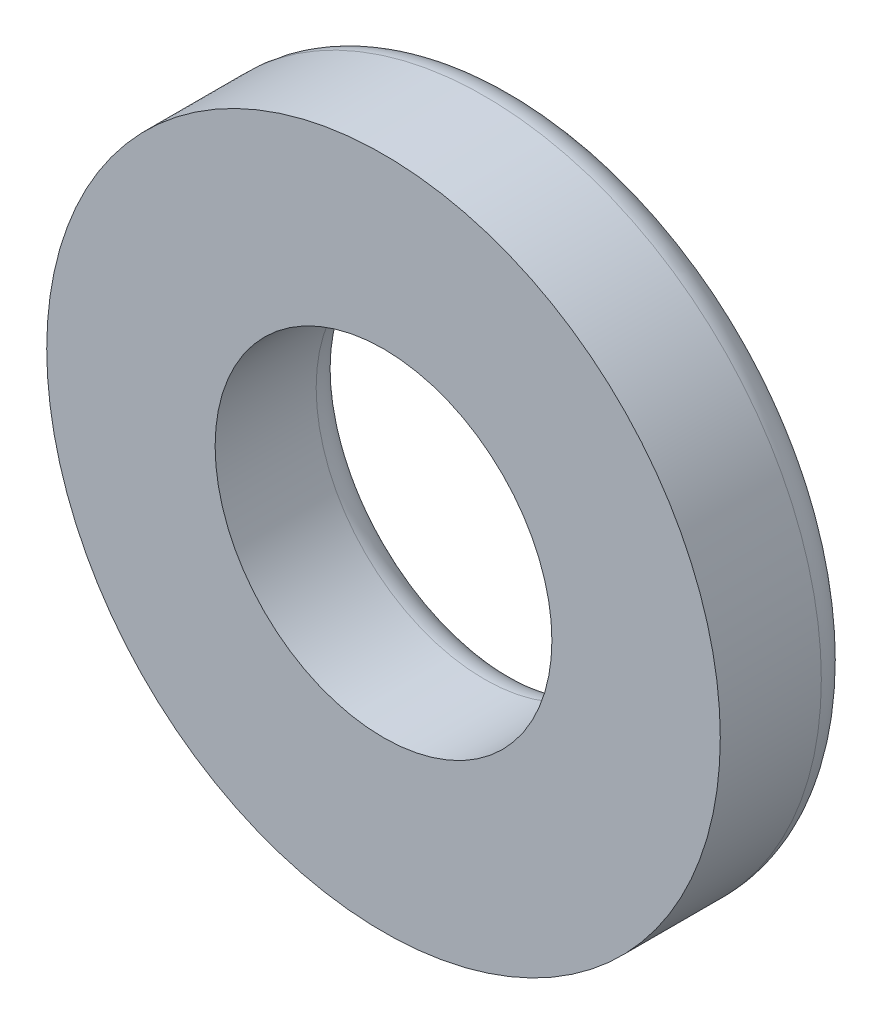
ISO-10303-21;
HEADER;
FILE_DESCRIPTION(('STEP AP214'),'2;1');
FILE_NAME('part.step','',(''),(''),'','','');
FILE_SCHEMA(('AUTOMOTIVE_DESIGN { 1 0 10303 214 1 1 1 1 }'));
ENDSEC;
DATA;
#1=APPLICATION_CONTEXT('core data for automotive mechanical design processes');
#2=APPLICATION_PROTOCOL_DEFINITION('international standard','automotive_design',2000,#1);
#3=PRODUCT_CONTEXT('',#1,'mechanical');
#4=PRODUCT('Part','Part','',(#3));
#5=PRODUCT_RELATED_PRODUCT_CATEGORY('part','',(#4));
#6=PRODUCT_DEFINITION_FORMATION('','',#4);
#7=PRODUCT_DEFINITION_CONTEXT('part definition',#1,'design');
#8=PRODUCT_DEFINITION('design','',#6,#7);
#9=PRODUCT_DEFINITION_SHAPE('','',#8);
#10=(LENGTH_UNIT() NAMED_UNIT(*) SI_UNIT(.MILLI.,.METRE.));
#11=(NAMED_UNIT(*) PLANE_ANGLE_UNIT() SI_UNIT($,.RADIAN.));
#12=(NAMED_UNIT(*) SI_UNIT($,.STERADIAN.) SOLID_ANGLE_UNIT());
#13=UNCERTAINTY_MEASURE_WITH_UNIT(LENGTH_MEASURE(1.E-05),#10,'distance_accuracy_value','');
#14=(GEOMETRIC_REPRESENTATION_CONTEXT(3) GLOBAL_UNCERTAINTY_ASSIGNED_CONTEXT((#13)) GLOBAL_UNIT_ASSIGNED_CONTEXT((#10,
#11,#12)) REPRESENTATION_CONTEXT('',''));
#15=CARTESIAN_POINT('',(0.,0.,0.));
#16=DIRECTION('',(0.,0.,1.));
#17=DIRECTION('',(1.,0.,0.));
#18=AXIS2_PLACEMENT_3D('',#15,#16,#17);
#19=CARTESIAN_POINT('',(0.,0.,12.));
#20=DIRECTION('',(0.,0.,1.));
#21=DIRECTION('',(1.,0.,0.));
#22=AXIS2_PLACEMENT_3D('',#19,#20,#21);
#23=PLANE('',#22);
#24=CARTESIAN_POINT('',(0.,0.,12.));
#25=DIRECTION('',(0.,0.,1.));
#26=DIRECTION('',(1.,0.,0.));
#27=AXIS2_PLACEMENT_3D('',#24,#25,#26);
#28=CIRCLE('',#27,30.);
#29=CARTESIAN_POINT('',(30.,0.,12.));
#30=VERTEX_POINT('',#29);
#31=EDGE_CURVE('E58',#30,#30,#28,.T.);
#32=ORIENTED_EDGE('',*,*,#31,.T.);
#33=EDGE_LOOP('',(#32));
#34=FACE_BOUND('',#33,.T.);
#35=CARTESIAN_POINT('',(0.,0.,12.));
#36=DIRECTION('',(0.,0.,1.));
#37=DIRECTION('',(1.,0.,0.));
#38=AXIS2_PLACEMENT_3D('',#35,#36,#37);
#39=CIRCLE('',#38,15.);
#40=CARTESIAN_POINT('',(15.,0.,12.));
#41=VERTEX_POINT('',#40);
#42=EDGE_CURVE('E61',#41,#41,#39,.T.);
#43=ORIENTED_EDGE('',*,*,#42,.F.);
#44=EDGE_LOOP('',(#43));
#45=FACE_BOUND('',#44,.T.);
#46=ADVANCED_FACE('F38',(#34,#45),#23,.T.);
#47=CARTESIAN_POINT('',(0.,0.,0.));
#48=DIRECTION('',(0.,0.,1.));
#49=DIRECTION('',(1.,0.,0.));
#50=AXIS2_PLACEMENT_3D('',#47,#48,#49);
#51=PLANE('',#50);
#52=CARTESIAN_POINT('',(0.,0.,0.));
#53=DIRECTION('',(0.,0.,1.));
#54=DIRECTION('',(1.,0.,0.));
#55=AXIS2_PLACEMENT_3D('',#52,#53,#54);
#56=CIRCLE('',#55,18.);
#57=CARTESIAN_POINT('',(18.,0.,0.));
#58=VERTEX_POINT('',#57);
#59=EDGE_CURVE('E49',#58,#58,#56,.T.);
#60=ORIENTED_EDGE('',*,*,#59,.T.);
#61=EDGE_LOOP('',(#60));
#62=FACE_BOUND('',#61,.T.);
#63=CARTESIAN_POINT('',(0.,0.,0.));
#64=DIRECTION('',(0.,0.,1.));
#65=DIRECTION('',(1.,0.,0.));
#66=AXIS2_PLACEMENT_3D('',#63,#64,#65);
#67=CIRCLE('',#66,27.);
#68=CARTESIAN_POINT('',(27.,0.,0.));
#69=VERTEX_POINT('',#68);
#70=EDGE_CURVE('E53',#69,#69,#67,.F.);
#71=ORIENTED_EDGE('',*,*,#70,.T.);
#72=EDGE_LOOP('',(#71));
#73=FACE_BOUND('',#72,.T.);
#74=ADVANCED_FACE('F68',(#62,#73),#51,.F.);
#75=CARTESIAN_POINT('',(0.,0.,12.));
#76=DIRECTION('',(0.,0.,-1.));
#77=DIRECTION('',(-1.,0.,0.));
#78=AXIS2_PLACEMENT_3D('',#75,#76,#77);
#79=CYLINDRICAL_SURFACE('',#78,30.);
#80=CARTESIAN_POINT('',(0.,0.,3.));
#81=DIRECTION('',(0.,0.,1.));
#82=DIRECTION('',(1.,0.,0.));
#83=AXIS2_PLACEMENT_3D('',#80,#81,#82);
#84=CIRCLE('',#83,30.);
#85=CARTESIAN_POINT('',(30.,0.,3.));
#86=VERTEX_POINT('',#85);
#87=EDGE_CURVE('E10',#86,#86,#84,.T.);
#88=ORIENTED_EDGE('',*,*,#87,.T.);
#89=EDGE_LOOP('',(#88));
#90=FACE_BOUND('',#89,.T.);
#91=ORIENTED_EDGE('',*,*,#31,.F.);
#92=EDGE_LOOP('',(#91));
#93=FACE_BOUND('',#92,.T.);
#94=ADVANCED_FACE('F75',(#90,#93),#79,.T.);
#95=CARTESIAN_POINT('',(0.,0.,12.));
#96=DIRECTION('',(0.,0.,-1.));
#97=DIRECTION('',(-1.,0.,0.));
#98=AXIS2_PLACEMENT_3D('',#95,#96,#97);
#99=CYLINDRICAL_SURFACE('',#98,15.);
#100=CARTESIAN_POINT('',(0.,0.,3.));
#101=DIRECTION('',(0.,0.,1.));
#102=DIRECTION('',(1.,0.,0.));
#103=AXIS2_PLACEMENT_3D('',#100,#101,#102);
#104=CIRCLE('',#103,15.);
#105=CARTESIAN_POINT('',(15.,0.,3.));
#106=VERTEX_POINT('',#105);
#107=EDGE_CURVE('E45',#106,#106,#104,.F.);
#108=ORIENTED_EDGE('',*,*,#107,.T.);
#109=EDGE_LOOP('',(#108));
#110=FACE_BOUND('',#109,.T.);
#111=ORIENTED_EDGE('',*,*,#42,.T.);
#112=EDGE_LOOP('',(#111));
#113=FACE_BOUND('',#112,.T.);
#114=ADVANCED_FACE('F65',(#110,#113),#99,.F.);
#115=CARTESIAN_POINT('',(0.,0.,3.));
#116=DIRECTION('',(0.,0.,1.));
#117=DIRECTION('',(1.,0.,0.));
#118=AXIS2_PLACEMENT_3D('',#115,#116,#117);
#119=TOROIDAL_SURFACE('',#118,18.,3.);
#120=ORIENTED_EDGE('',*,*,#107,.F.);
#121=EDGE_LOOP('',(#120));
#122=FACE_BOUND('',#121,.T.);
#123=ORIENTED_EDGE('',*,*,#59,.F.);
#124=EDGE_LOOP('',(#123));
#125=FACE_BOUND('',#124,.T.);
#126=ADVANCED_FACE('F81',(#122,#125),#119,.T.);
#127=CARTESIAN_POINT('',(0.,0.,3.));
#128=DIRECTION('',(0.,0.,1.));
#129=DIRECTION('',(1.,0.,0.));
#130=AXIS2_PLACEMENT_3D('',#127,#128,#129);
#131=TOROIDAL_SURFACE('',#130,27.,3.);
#132=ORIENTED_EDGE('',*,*,#70,.F.);
#133=EDGE_LOOP('',(#132));
#134=FACE_BOUND('',#133,.T.);
#135=ORIENTED_EDGE('',*,*,#87,.F.);
#136=EDGE_LOOP('',(#135));
#137=FACE_BOUND('',#136,.T.);
#138=ADVANCED_FACE('F40',(#134,#137),#131,.T.);
#139=CLOSED_SHELL('',(#46,#74,#94,#114,#126,#138));
#140=MANIFOLD_SOLID_BREP('B2',#139);
#141=ADVANCED_BREP_SHAPE_REPRESENTATION('',(#18,#140),#14);
#142=SHAPE_DEFINITION_REPRESENTATION(#9,#141);
ENDSEC;
END-ISO-10303-21;
